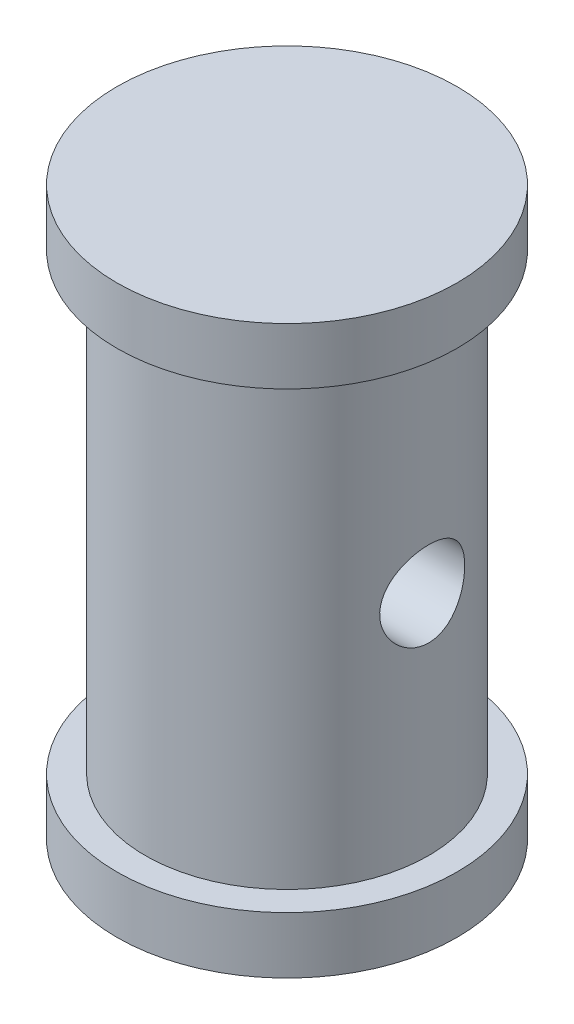
ISO-10303-21;
HEADER;
FILE_DESCRIPTION(('STEP AP214'),'2;1');
FILE_NAME('part.step','',(''),(''),'','','');
FILE_SCHEMA(('AUTOMOTIVE_DESIGN { 1 0 10303 214 1 1 1 1 }'));
ENDSEC;
DATA;
#1=APPLICATION_CONTEXT('core data for automotive mechanical design processes');
#2=APPLICATION_PROTOCOL_DEFINITION('international standard','automotive_design',2000,#1);
#3=PRODUCT_CONTEXT('',#1,'mechanical');
#4=PRODUCT('Part','Part','',(#3));
#5=PRODUCT_RELATED_PRODUCT_CATEGORY('part','',(#4));
#6=PRODUCT_DEFINITION_FORMATION('','',#4);
#7=PRODUCT_DEFINITION_CONTEXT('part definition',#1,'design');
#8=PRODUCT_DEFINITION('design','',#6,#7);
#9=PRODUCT_DEFINITION_SHAPE('','',#8);
#10=(LENGTH_UNIT() NAMED_UNIT(*) SI_UNIT(.MILLI.,.METRE.));
#11=(NAMED_UNIT(*) PLANE_ANGLE_UNIT() SI_UNIT($,.RADIAN.));
#12=(NAMED_UNIT(*) SI_UNIT($,.STERADIAN.) SOLID_ANGLE_UNIT());
#13=UNCERTAINTY_MEASURE_WITH_UNIT(LENGTH_MEASURE(1.E-05),#10,'distance_accuracy_value','');
#14=(GEOMETRIC_REPRESENTATION_CONTEXT(3) GLOBAL_UNCERTAINTY_ASSIGNED_CONTEXT((#13)) GLOBAL_UNIT_ASSIGNED_CONTEXT((#10,
#11,#12)) REPRESENTATION_CONTEXT('',''));
#15=CARTESIAN_POINT('',(0.,0.,0.));
#16=DIRECTION('',(0.,0.,1.));
#17=DIRECTION('',(1.,0.,0.));
#18=AXIS2_PLACEMENT_3D('',#15,#16,#17);
#19=CARTESIAN_POINT('',(0.,18.,0.));
#20=DIRECTION('',(0.,-1.,0.));
#21=DIRECTION('',(0.,0.,-1.));
#22=AXIS2_PLACEMENT_3D('',#19,#20,#21);
#23=CYLINDRICAL_SURFACE('',#22,2.49);
#24=CARTESIAN_POINT('',(0.,0.,0.));
#25=DIRECTION('',(0.,-1.,0.));
#26=DIRECTION('',(0.,0.,-1.));
#27=AXIS2_PLACEMENT_3D('',#24,#25,#26);
#28=CIRCLE('',#27,2.49);
#29=CARTESIAN_POINT('',(0.,0.,-2.49));
#30=VERTEX_POINT('',#29);
#31=EDGE_CURVE('E107',#30,#30,#28,.T.);
#32=ORIENTED_EDGE('',*,*,#31,.T.);
#33=EDGE_LOOP('',(#32));
#34=FACE_BOUND('',#33,.T.);
#35=CARTESIAN_POINT('',(0.,18.,0.));
#36=DIRECTION('',(0.,-1.,0.));
#37=DIRECTION('',(0.,0.,-1.));
#38=AXIS2_PLACEMENT_3D('',#35,#36,#37);
#39=CIRCLE('',#38,2.49);
#40=CARTESIAN_POINT('',(0.,18.,-2.49));
#41=VERTEX_POINT('',#40);
#42=EDGE_CURVE('E108',#41,#41,#39,.T.);
#43=ORIENTED_EDGE('',*,*,#42,.F.);
#44=EDGE_LOOP('',(#43));
#45=FACE_BOUND('',#44,.T.);
#46=DIRECTION('',(0.,-1.,0.));
#47=VECTOR('',#46,1.);
#48=CARTESIAN_POINT('',(2.,18.,1.4832734070292));
#49=LINE('',#48,#47);
#50=CARTESIAN_POINT('',(2.,9.77661692096311,1.4832734070292));
#51=VERTEX_POINT('',#50);
#52=CARTESIAN_POINT('',(2.,10.2233830790369,1.4832734070292));
#53=VERTEX_POINT('',#52);
#54=EDGE_CURVE('E11',#51,#53,#49,.F.);
#55=ORIENTED_EDGE('',*,*,#54,.F.);
#56=CARTESIAN_POINT('',(2.,9.77661692096311,1.4832734070292));
#57=CARTESIAN_POINT('',(2.00451641689461,9.73609208243435,1.47717343278689));
#58=CARTESIAN_POINT('',(2.01022262384104,9.69598702441084,1.46943176939736));
#59=CARTESIAN_POINT('',(2.02369617044362,9.61691701299149,1.45082492243512));
#60=CARTESIAN_POINT('',(2.03146074485795,9.57795060731097,1.43996392779848));
#61=CARTESIAN_POINT('',(2.05726523958766,9.46359673313475,1.40308679703302));
#62=CARTESIAN_POINT('',(2.07788962451289,9.39016774124797,1.37268464069959));
#63=CARTESIAN_POINT('',(2.12311483034521,9.25040653047264,1.30163053752464));
#64=CARTESIAN_POINT('',(2.14769608576624,9.18404193366019,1.26102849874818));
#65=CARTESIAN_POINT('',(2.19842868335353,9.05857350690383,1.17034961459316));
#66=CARTESIAN_POINT('',(2.22458355146461,8.99948696051237,1.1202509063738));
#67=CARTESIAN_POINT('',(2.27942183574636,8.88256516086136,1.00445908243937));
#68=CARTESIAN_POINT('',(2.30800628999421,8.82583484889207,0.937594761985534));
#69=CARTESIAN_POINT('',(2.36126710077192,8.72432556604292,0.793961191956514));
#70=CARTESIAN_POINT('',(2.38594581290057,8.67953938026696,0.717197963622885));
#71=CARTESIAN_POINT('',(2.42811984616116,8.60479699579717,0.557626576069205));
#72=CARTESIAN_POINT('',(2.44579522801062,8.57446433538724,0.475044790334752));
#73=CARTESIAN_POINT('',(2.47279943610715,8.52861083868138,0.304587571481967));
#74=CARTESIAN_POINT('',(2.48213884564127,8.51307121957895,0.216719002228572));
#75=CARTESIAN_POINT('',(2.49064075198707,8.49892951264923,0.0516329980521774));
#76=CARTESIAN_POINT('',(2.4910471870844,8.49825704699864,-0.0253492612048042));
#77=CARTESIAN_POINT('',(2.48479055568032,8.50865738092359,-0.178215862971857));
#78=CARTESIAN_POINT('',(2.47812855679429,8.51972840676358,-0.254100369531831));
#79=CARTESIAN_POINT('',(2.45890369026106,8.55215133926942,-0.398682832003539));
#80=CARTESIAN_POINT('',(2.44665900350464,8.5729502835423,-0.467549934062095));
#81=CARTESIAN_POINT('',(2.41741347557373,8.62369439093039,-0.600719189111875));
#82=CARTESIAN_POINT('',(2.40041225242278,8.65364028861477,-0.66502097496254));
#83=CARTESIAN_POINT('',(2.36127339937101,8.72467007467832,-0.793327726625811));
#84=CARTESIAN_POINT('',(2.33881833273497,8.7664942730993,-0.856824096984697));
#85=CARTESIAN_POINT('',(2.29151253258019,8.85872912233407,-0.976325134117998));
#86=CARTESIAN_POINT('',(2.26665856040578,8.90915145350719,-1.03231942222685));
#87=CARTESIAN_POINT('',(2.21299965172858,9.02518076091213,-1.14325520597899));
#88=CARTESIAN_POINT('',(2.18412378416384,9.0919233968638,-1.19697949229149));
#89=CARTESIAN_POINT('',(2.128921287042,9.23417164593233,-1.29260726860246));
#90=CARTESIAN_POINT('',(2.10258917235845,9.30965759553078,-1.33453658354129));
#91=CARTESIAN_POINT('',(2.06148014707517,9.44961181774251,-1.39694918681763));
#92=CARTESIAN_POINT('',(2.04544240223147,9.51248739677204,-1.42015766542006));
#93=CARTESIAN_POINT('',(2.01845652098597,9.64200979941398,-1.45823168519624));
#94=CARTESIAN_POINT('',(2.00752863319329,9.70867047212304,-1.47306408222207));
#95=CARTESIAN_POINT('',(2.,9.77661692096311,-1.4832734070292));
#96=B_SPLINE_CURVE_WITH_KNOTS('',3,(#56,#57,#58,#59,#60,#61,#62,#63,#64,#65,#66,#67,#68,#69,#70,
#71,#72,#73,#74,#75,#76,#77,#78,#79,#80,#81,#82,#83,#84,#85,#86,#87,#88,#89,#90,#91,#92,#93,#94,
#95),.UNSPECIFIED.,.F.,.F.,(4,2,2,2,2,2,2,2,2,2,2,2,2,2,2,2,2,2,2,4),(0.,0.123570687084218,
0.246976201392812,0.492018814911605,0.735885023862423,0.980319624023013,1.25569232237355,
1.53089830206557,1.79848029462242,2.06572208189424,2.29547143053522,2.52518608280284,
2.74318847416954,2.96120837737334,3.19812130367795,3.43535867259672,3.70541473963055,
3.974874836619,4.18086734203421,4.38766934849192),.UNSPECIFIED.);
#97=CARTESIAN_POINT('',(2.,9.77661692096311,-1.4832734070292));
#98=VERTEX_POINT('',#97);
#99=EDGE_CURVE('E47',#51,#98,#96,.T.);
#100=ORIENTED_EDGE('',*,*,#99,.T.);
#101=DIRECTION('',(0.,-1.,0.));
#102=VECTOR('',#101,1.);
#103=CARTESIAN_POINT('',(2.,18.,-1.4832734070292));
#104=LINE('',#103,#102);
#105=CARTESIAN_POINT('',(2.,10.2233830790369,-1.4832734070292));
#106=VERTEX_POINT('',#105);
#107=EDGE_CURVE('E57',#106,#98,#104,.T.);
#108=ORIENTED_EDGE('',*,*,#107,.F.);
#109=CARTESIAN_POINT('',(2.,10.2233830790369,-1.4832734070292));
#110=CARTESIAN_POINT('',(2.00451641689461,10.2639079175657,-1.47717343278689));
#111=CARTESIAN_POINT('',(2.01022262384104,10.3040129755892,-1.46943176939736));
#112=CARTESIAN_POINT('',(2.02369617044362,10.3830829870085,-1.45082492243512));
#113=CARTESIAN_POINT('',(2.03146074485795,10.422049392689,-1.43996392779848));
#114=CARTESIAN_POINT('',(2.05726523958766,10.5364032668653,-1.40308679703302));
#115=CARTESIAN_POINT('',(2.07788962451289,10.609832258752,-1.37268464069959));
#116=CARTESIAN_POINT('',(2.12311483034521,10.7495934695274,-1.30163053752464));
#117=CARTESIAN_POINT('',(2.14769608576624,10.8159580663398,-1.26102849874818));
#118=CARTESIAN_POINT('',(2.19842868335353,10.9414264930962,-1.17034961459316));
#119=CARTESIAN_POINT('',(2.22458355146461,11.0005130394876,-1.1202509063738));
#120=CARTESIAN_POINT('',(2.27942183574636,11.1174348391386,-1.00445908243937));
#121=CARTESIAN_POINT('',(2.30800628999421,11.1741651511079,-0.937594761985534));
#122=CARTESIAN_POINT('',(2.36126710077192,11.2756744339571,-0.793961191956514));
#123=CARTESIAN_POINT('',(2.38594581290057,11.320460619733,-0.717197963622885));
#124=CARTESIAN_POINT('',(2.42811984616116,11.3952030042028,-0.557626576069205));
#125=CARTESIAN_POINT('',(2.44579522801062,11.4255356646128,-0.475044790334752));
#126=CARTESIAN_POINT('',(2.47279943610715,11.4713891613186,-0.304587571481967));
#127=CARTESIAN_POINT('',(2.48213884564127,11.486928780421,-0.216719002228572));
#128=CARTESIAN_POINT('',(2.49064075198707,11.5010704873508,-0.0516329980521774));
#129=CARTESIAN_POINT('',(2.4910471870844,11.5017429530014,0.0253492612048042));
#130=CARTESIAN_POINT('',(2.48479055568032,11.4913426190764,0.178215862971857));
#131=CARTESIAN_POINT('',(2.47812855679429,11.4802715932364,0.254100369531831));
#132=CARTESIAN_POINT('',(2.45890369026106,11.4478486607306,0.398682832003538));
#133=CARTESIAN_POINT('',(2.44665900350464,11.4270497164577,0.467549934062095));
#134=CARTESIAN_POINT('',(2.41741347557373,11.3763056090696,0.600719189111875));
#135=CARTESIAN_POINT('',(2.40041225242278,11.3463597113852,0.66502097496254));
#136=CARTESIAN_POINT('',(2.36127339937101,11.2753299253217,0.793327726625811));
#137=CARTESIAN_POINT('',(2.33881833273497,11.2335057269007,0.856824096984696));
#138=CARTESIAN_POINT('',(2.29151253258019,11.1412708776659,0.976325134117997));
#139=CARTESIAN_POINT('',(2.26665856040578,11.0908485464928,1.03231942222685));
#140=CARTESIAN_POINT('',(2.21299965172858,10.9748192390879,1.14325520597899));
#141=CARTESIAN_POINT('',(2.18412378416384,10.9080766031362,1.19697949229149));
#142=CARTESIAN_POINT('',(2.128921287042,10.7658283540677,1.29260726860246));
#143=CARTESIAN_POINT('',(2.10258917235845,10.6903424044692,1.33453658354129));
#144=CARTESIAN_POINT('',(2.06148014707517,10.5503881822575,1.39694918681763));
#145=CARTESIAN_POINT('',(2.04544240223147,10.487512603228,1.42015766542006));
#146=CARTESIAN_POINT('',(2.01845652098597,10.357990200586,1.45823168519624));
#147=CARTESIAN_POINT('',(2.00752863319329,10.291329527877,1.47306408222207));
#148=CARTESIAN_POINT('',(2.,10.2233830790369,1.4832734070292));
#149=B_SPLINE_CURVE_WITH_KNOTS('',3,(#109,#110,#111,#112,#113,#114,#115,#116,#117,#118,#119,
#120,#121,#122,#123,#124,#125,#126,#127,#128,#129,#130,#131,#132,#133,#134,#135,#136,#137,#138,
#139,#140,#141,#142,#143,#144,#145,#146,#147,#148),.UNSPECIFIED.,.F.,.F.,(4,2,2,2,2,2,2,2,2,2,2,
2,2,2,2,2,2,2,2,4),(0.,0.123570687084218,0.246976201392812,0.492018814911605,0.735885023862423,
0.980319624023013,1.25569232237355,1.53089830206557,1.79848029462242,2.06572208189424,
2.29547143053522,2.52518608280284,2.74318847416954,2.96120837737334,3.19812130367795,
3.43535867259672,3.70541473963055,3.974874836619,4.18086734203421,4.38766934849192),.UNSPECIFIED.);
#150=EDGE_CURVE('E74',#106,#53,#149,.T.);
#151=ORIENTED_EDGE('',*,*,#150,.T.);
#152=EDGE_LOOP('',(#55,#100,#108,#151));
#153=FACE_BOUND('',#152,.T.);
#154=ADVANCED_FACE('F39',(#34,#45,#153),#23,.F.);
#155=CARTESIAN_POINT('',(0.,0.,0.));
#156=DIRECTION('',(0.,1.,0.));
#157=DIRECTION('',(0.,0.,1.));
#158=AXIS2_PLACEMENT_3D('',#155,#156,#157);
#159=PLANE('',#158);
#160=ORIENTED_EDGE('',*,*,#31,.F.);
#161=EDGE_LOOP('',(#160));
#162=FACE_BOUND('',#161,.T.);
#163=CARTESIAN_POINT('',(0.,0.,0.));
#164=DIRECTION('',(0.,-1.,0.));
#165=DIRECTION('',(0.,0.,-1.));
#166=AXIS2_PLACEMENT_3D('',#163,#164,#165);
#167=CIRCLE('',#166,6.);
#168=CARTESIAN_POINT('',(0.,0.,-6.));
#169=VERTEX_POINT('',#168);
#170=EDGE_CURVE('E78',#169,#169,#167,.T.);
#171=ORIENTED_EDGE('',*,*,#170,.T.);
#172=EDGE_LOOP('',(#171));
#173=FACE_BOUND('',#172,.T.);
#174=ADVANCED_FACE('F41',(#162,#173),#159,.F.);
#175=CARTESIAN_POINT('',(0.,0.,0.));
#176=DIRECTION('',(0.,-1.,0.));
#177=DIRECTION('',(0.,0.,-1.));
#178=AXIS2_PLACEMENT_3D('',#175,#176,#177);
#179=CYLINDRICAL_SURFACE('',#178,6.);
#180=ORIENTED_EDGE('',*,*,#170,.F.);
#181=EDGE_LOOP('',(#180));
#182=FACE_BOUND('',#181,.T.);
#183=CARTESIAN_POINT('',(0.,2.,0.));
#184=DIRECTION('',(0.,-1.,0.));
#185=DIRECTION('',(0.,0.,-1.));
#186=AXIS2_PLACEMENT_3D('',#183,#184,#185);
#187=CIRCLE('',#186,6.);
#188=CARTESIAN_POINT('',(0.,2.,-6.));
#189=VERTEX_POINT('',#188);
#190=EDGE_CURVE('E154',#189,#189,#187,.T.);
#191=ORIENTED_EDGE('',*,*,#190,.T.);
#192=EDGE_LOOP('',(#191));
#193=FACE_BOUND('',#192,.T.);
#194=ADVANCED_FACE('F120',(#182,#193),#179,.T.);
#195=CARTESIAN_POINT('',(-6.,2.,0.));
#196=DIRECTION('',(0.,-1.,0.));
#197=DIRECTION('',(0.,0.,-1.));
#198=AXIS2_PLACEMENT_3D('',#195,#196,#197);
#199=PLANE('',#198);
#200=ORIENTED_EDGE('',*,*,#190,.F.);
#201=EDGE_LOOP('',(#200));
#202=FACE_BOUND('',#201,.T.);
#203=CARTESIAN_POINT('',(0.,2.,0.));
#204=DIRECTION('',(0.,-1.,0.));
#205=DIRECTION('',(0.,0.,-1.));
#206=AXIS2_PLACEMENT_3D('',#203,#204,#205);
#207=CIRCLE('',#206,5.);
#208=CARTESIAN_POINT('',(0.,2.,-5.));
#209=VERTEX_POINT('',#208);
#210=EDGE_CURVE('E151',#209,#209,#207,.T.);
#211=ORIENTED_EDGE('',*,*,#210,.T.);
#212=EDGE_LOOP('',(#211));
#213=FACE_BOUND('',#212,.T.);
#214=ADVANCED_FACE('F116',(#202,#213),#199,.F.);
#215=CARTESIAN_POINT('',(0.,0.,0.));
#216=DIRECTION('',(0.,-1.,0.));
#217=DIRECTION('',(0.,0.,-1.));
#218=AXIS2_PLACEMENT_3D('',#215,#216,#217);
#219=CYLINDRICAL_SURFACE('',#218,5.);
#220=CARTESIAN_POINT('',(4.76969600708473,10.,-1.5));
#221=CARTESIAN_POINT('',(4.7696968572698,9.9178054520576,-1.49999897633764));
#222=CARTESIAN_POINT('',(4.77184390209069,9.83560077585598,-1.49322108167142));
#223=CARTESIAN_POINT('',(4.780165783029,9.67359475040806,-1.46635844446749));
#224=CARTESIAN_POINT('',(4.78634196493468,9.59379421349854,-1.44626925573578));
#225=CARTESIAN_POINT('',(4.80196102485632,9.43896527172827,-1.39352753269955));
#226=CARTESIAN_POINT('',(4.81139846703232,9.36392917036692,-1.36089589394243));
#227=CARTESIAN_POINT('',(4.83246932547567,9.2203780660047,-1.28406421917929));
#228=CARTESIAN_POINT('',(4.84410307041019,9.15186404131556,-1.23986245137053));
#229=CARTESIAN_POINT('',(4.86866862185765,9.02113360942263,-1.13964754141627));
#230=CARTESIAN_POINT('',(4.88162808311636,8.95915410205372,-1.08333207175807));
#231=CARTESIAN_POINT('',(4.90714861936757,8.84536204867749,-0.961136237579599));
#232=CARTESIAN_POINT('',(4.91970964297705,8.79355080955012,-0.895254645461112));
#233=CARTESIAN_POINT('',(4.94333214579389,8.7005373001667,-0.754111437793691));
#234=CARTESIAN_POINT('',(4.95435724342404,8.65957657555719,-0.678684021335815));
#235=CARTESIAN_POINT('',(4.97334435920684,8.59101274095725,-0.521624645369354));
#236=CARTESIAN_POINT('',(4.98130703789495,8.56340675014255,-0.439994028387912));
#237=CARTESIAN_POINT('',(4.99307646003589,8.5231199989095,-0.27532385263083));
#238=CARTESIAN_POINT('',(4.99699557369338,8.5100348723473,-0.192391398953802));
#239=CARTESIAN_POINT('',(5.00063201501348,8.49788267535356,-0.0254218237493157));
#240=CARTESIAN_POINT('',(5.00035022521079,8.49881266059804,0.0586150620503674));
#241=CARTESIAN_POINT('',(4.99569603817659,8.51439286854303,0.222571156600159));
#242=CARTESIAN_POINT('',(4.9914542020526,8.52860519380987,0.30253626764134));
#243=CARTESIAN_POINT('',(4.97951522112593,8.56963133599429,0.458889213442526));
#244=CARTESIAN_POINT('',(4.97181785750586,8.59644595094267,0.535276821322845));
#245=CARTESIAN_POINT('',(4.95365220986963,8.66221202341856,0.68334732635128));
#246=CARTESIAN_POINT('',(4.94315269676706,8.70130120280727,0.754965064694477));
#247=CARTESIAN_POINT('',(4.92049640648069,8.79039785242823,0.890764673783155));
#248=CARTESIAN_POINT('',(4.90833923637778,8.84040791296349,0.95494477487213));
#249=CARTESIAN_POINT('',(4.88311550488166,8.9521977507516,1.0766604815298));
#250=CARTESIAN_POINT('',(4.87003195321461,9.01435691902974,1.13384458040111));
#251=CARTESIAN_POINT('',(4.84483979887497,9.14751001789005,1.23707651539823));
#252=CARTESIAN_POINT('',(4.8327312931702,9.21850482538923,1.28312324482852));
#253=CARTESIAN_POINT('',(4.81077903197678,9.36823946924899,1.3631399533545));
#254=CARTESIAN_POINT('',(4.80095810695957,9.44704704586292,1.39698989237679));
#255=CARTESIAN_POINT('',(4.78496392548436,9.60960720844554,1.45083362878413));
#256=CARTESIAN_POINT('',(4.7787894791583,9.69335817153456,1.4708319464056));
#257=CARTESIAN_POINT('',(4.77104849541241,9.86008236073928,1.49574770282165));
#258=CARTESIAN_POINT('',(4.76931878670441,9.94296822389398,1.50119946380212));
#259=CARTESIAN_POINT('',(4.77021192441924,10.1084729000099,1.49835947233062));
#260=CARTESIAN_POINT('',(4.77283416156589,10.1910917487308,1.4900696437133));
#261=CARTESIAN_POINT('',(4.78197558554912,10.3514883779709,1.4604576357419));
#262=CARTESIAN_POINT('',(4.78839176507489,10.4293361642635,1.4394796143128));
#263=CARTESIAN_POINT('',(4.80429141231227,10.5804016908149,1.3854857774794));
#264=CARTESIAN_POINT('',(4.81377535359073,10.6536187141406,1.3524681034276));
#265=CARTESIAN_POINT('',(4.83505835023047,10.7955174640721,1.274318711965));
#266=CARTESIAN_POINT('',(4.84691271069798,10.8640247209858,1.22888564172729));
#267=CARTESIAN_POINT('',(4.87148205646987,10.9926381061808,1.12755301600385));
#268=CARTESIAN_POINT('',(4.88419724730003,11.0527422176128,1.07165095534897));
#269=CARTESIAN_POINT('',(4.90963633548158,11.1651804058147,0.948455132493599));
#270=CARTESIAN_POINT('',(4.92234245063004,11.217135628987,0.880811065857434));
#271=CARTESIAN_POINT('',(4.94584851748651,11.3089667010278,0.73746178459025));
#272=CARTESIAN_POINT('',(4.95664856384717,11.3488431497815,0.661756970543945));
#273=CARTESIAN_POINT('',(4.97505970474957,11.4150000305683,0.504935504705224));
#274=CARTESIAN_POINT('',(4.98269453424966,11.441382016159,0.423864622037841));
#275=CARTESIAN_POINT('',(4.99401979596827,11.4800609188904,0.25816996650459));
#276=CARTESIAN_POINT('',(4.9977113567088,11.4923618659484,0.173547217354765));
#277=CARTESIAN_POINT('',(5.00066544081399,11.5022230440545,0.00665215388274478));
#278=CARTESIAN_POINT('',(5.00009305111322,11.5003326954078,-0.0755851790862046));
#279=CARTESIAN_POINT('',(4.99497264465037,11.4831783675009,-0.238519481164402));
#280=CARTESIAN_POINT('',(4.99042485330462,11.4679151465196,-0.319216537346527));
#281=CARTESIAN_POINT('',(4.97791168358327,11.4247883386004,-0.475935813041356));
#282=CARTESIAN_POINT('',(4.96998352900866,11.397061819351,-0.55199892735139));
#283=CARTESIAN_POINT('',(4.9515294303945,11.3299180854928,-0.698433237752051));
#284=CARTESIAN_POINT('',(4.94100305949946,11.2904989497138,-0.768803496050578));
#285=CARTESIAN_POINT('',(4.91803965828228,11.19962654257,-0.904301892420561));
#286=CARTESIAN_POINT('',(4.90555226923559,11.1478285699992,-0.969190250076764));
#287=CARTESIAN_POINT('',(4.88023537212334,11.0342896116672,-1.08953757134594));
#288=CARTESIAN_POINT('',(4.86740576641079,10.9725457621019,-1.14499380960193));
#289=CARTESIAN_POINT('',(4.84240680631319,10.8386592216895,-1.24656269394549));
#290=CARTESIAN_POINT('',(4.83026852693485,10.7662614466096,-1.29234759757956));
#291=CARTESIAN_POINT('',(4.80852547508793,10.614444825839,-1.37104313528775));
#292=CARTESIAN_POINT('',(4.79891948596956,10.5350293763988,-1.40395995557288));
#293=CARTESIAN_POINT('',(4.78427816717594,10.3802595683937,-1.4530194253295));
#294=CARTESIAN_POINT('',(4.7788615484052,10.305391353069,-1.47058859011232));
#295=CARTESIAN_POINT('',(4.77157042597167,10.1536847775042,-1.49407818835144));
#296=CARTESIAN_POINT('',(4.7696952122143,10.0768468153548,-1.50000095706095));
#297=CARTESIAN_POINT('',(4.76969600708473,10.,-1.5));
#298=B_SPLINE_CURVE_WITH_KNOTS('',3,(#220,#221,#222,#223,#224,#225,#226,#227,#228,#229,#230,
#231,#232,#233,#234,#235,#236,#237,#238,#239,#240,#241,#242,#243,#244,#245,#246,#247,#248,#249,
#250,#251,#252,#253,#254,#255,#256,#257,#258,#259,#260,#261,#262,#263,#264,#265,#266,#267,#268,
#269,#270,#271,#272,#273,#274,#275,#276,#277,#278,#279,#280,#281,#282,#283,#284,#285,#286,#287,
#288,#289,#290,#291,#292,#293,#294,#295,#296,#297),.UNSPECIFIED.,.T.,.F.,(4,2,2,2,2,2,2,2,2,2,2,
2,2,2,2,2,2,2,2,2,2,2,2,2,2,2,2,2,2,2,2,2,2,2,2,2,2,2,4),(0.,0.246300165915544,
0.492682641688999,0.738656414466193,0.9846670253701,1.23773150007984,1.49082847871273,
1.74915939273644,2.00743455587877,2.25832140149558,2.5091555410144,2.7520012599088,
2.99486235890376,3.24055209335676,3.4863001659083,3.74152147023278,3.99676812491863,
4.25446238246266,4.51207250628411,4.76008080790309,5.00805439107387,5.24958594938817,
5.49115481045787,5.73920731809388,5.98731925928923,6.24479506100602,6.50225807324202,
6.75775391814325,7.01317662321682,7.2587630391122,7.50433553047754,7.74727096872219,
7.99024634491378,8.24099627054488,8.4918185262989,8.75011639669147,9.00828993963944,
9.23861153857448,9.4688869503356),.UNSPECIFIED.);
#299=CARTESIAN_POINT('',(4.76969600708473,10.,-1.5));
#300=VERTEX_POINT('',#299);
#301=EDGE_CURVE('E75',#300,#300,#298,.T.);
#302=ORIENTED_EDGE('',*,*,#301,.T.);
#303=EDGE_LOOP('',(#302));
#304=FACE_BOUND('',#303,.T.);
#305=ORIENTED_EDGE('',*,*,#210,.F.);
#306=EDGE_LOOP('',(#305));
#307=FACE_BOUND('',#306,.T.);
#308=CARTESIAN_POINT('',(0.,18.,0.));
#309=DIRECTION('',(0.,-1.,0.));
#310=DIRECTION('',(0.,0.,-1.));
#311=AXIS2_PLACEMENT_3D('',#308,#309,#310);
#312=CIRCLE('',#311,5.);
#313=CARTESIAN_POINT('',(0.,18.,-5.));
#314=VERTEX_POINT('',#313);
#315=EDGE_CURVE('E148',#314,#314,#312,.T.);
#316=ORIENTED_EDGE('',*,*,#315,.T.);
#317=EDGE_LOOP('',(#316));
#318=FACE_BOUND('',#317,.T.);
#319=ADVANCED_FACE('F110',(#304,#307,#318),#219,.T.);
#320=CARTESIAN_POINT('',(-5.,18.,0.));
#321=DIRECTION('',(0.,1.,0.));
#322=DIRECTION('',(0.,0.,1.));
#323=AXIS2_PLACEMENT_3D('',#320,#321,#322);
#324=PLANE('',#323);
#325=ORIENTED_EDGE('',*,*,#315,.F.);
#326=EDGE_LOOP('',(#325));
#327=FACE_BOUND('',#326,.T.);
#328=CARTESIAN_POINT('',(0.,18.,0.));
#329=DIRECTION('',(0.,-1.,0.));
#330=DIRECTION('',(0.,0.,-1.));
#331=AXIS2_PLACEMENT_3D('',#328,#329,#330);
#332=CIRCLE('',#331,6.);
#333=CARTESIAN_POINT('',(0.,18.,-6.));
#334=VERTEX_POINT('',#333);
#335=EDGE_CURVE('E143',#334,#334,#332,.T.);
#336=ORIENTED_EDGE('',*,*,#335,.T.);
#337=EDGE_LOOP('',(#336));
#338=FACE_BOUND('',#337,.T.);
#339=ADVANCED_FACE('F115',(#327,#338),#324,.F.);
#340=CARTESIAN_POINT('',(0.,0.,0.));
#341=DIRECTION('',(0.,-1.,0.));
#342=DIRECTION('',(0.,0.,-1.));
#343=AXIS2_PLACEMENT_3D('',#340,#341,#342);
#344=CYLINDRICAL_SURFACE('',#343,6.);
#345=ORIENTED_EDGE('',*,*,#335,.F.);
#346=EDGE_LOOP('',(#345));
#347=FACE_BOUND('',#346,.T.);
#348=CARTESIAN_POINT('',(0.,20.,0.));
#349=DIRECTION('',(0.,-1.,0.));
#350=DIRECTION('',(0.,0.,-1.));
#351=AXIS2_PLACEMENT_3D('',#348,#349,#350);
#352=CIRCLE('',#351,6.);
#353=CARTESIAN_POINT('',(0.,20.,-6.));
#354=VERTEX_POINT('',#353);
#355=EDGE_CURVE('E141',#354,#354,#352,.T.);
#356=ORIENTED_EDGE('',*,*,#355,.T.);
#357=EDGE_LOOP('',(#356));
#358=FACE_BOUND('',#357,.T.);
#359=ADVANCED_FACE('F167',(#347,#358),#344,.T.);
#360=CARTESIAN_POINT('',(-6.,20.,0.));
#361=DIRECTION('',(0.,-1.,0.));
#362=DIRECTION('',(0.,0.,-1.));
#363=AXIS2_PLACEMENT_3D('',#360,#361,#362);
#364=PLANE('',#363);
#365=ORIENTED_EDGE('',*,*,#355,.F.);
#366=EDGE_LOOP('',(#365));
#367=FACE_BOUND('',#366,.T.);
#368=ADVANCED_FACE('F172',(#367),#364,.F.);
#369=CARTESIAN_POINT('',(0.,18.,0.));
#370=DIRECTION('',(0.,-1.,0.));
#371=DIRECTION('',(0.,0.,-1.));
#372=AXIS2_PLACEMENT_3D('',#369,#370,#371);
#373=PLANE('',#372);
#374=ORIENTED_EDGE('',*,*,#42,.T.);
#375=EDGE_LOOP('',(#374));
#376=FACE_BOUND('',#375,.T.);
#377=ADVANCED_FACE('F97',(#376),#373,.T.);
#378=CARTESIAN_POINT('',(2.,10.,0.));
#379=DIRECTION('',(1.,0.,0.));
#380=DIRECTION('',(0.,0.,-1.));
#381=AXIS2_PLACEMENT_3D('',#378,#379,#380);
#382=CYLINDRICAL_SURFACE('',#381,1.5);
#383=CARTESIAN_POINT('',(2.,10.,0.));
#384=DIRECTION('',(1.,0.,0.));
#385=DIRECTION('',(0.,0.,-1.));
#386=AXIS2_PLACEMENT_3D('',#383,#384,#385);
#387=CIRCLE('',#386,1.5);
#388=EDGE_CURVE('E67',#53,#51,#387,.T.);
#389=ORIENTED_EDGE('',*,*,#388,.F.);
#390=ORIENTED_EDGE('',*,*,#150,.F.);
#391=EDGE_CURVE('E53',#98,#106,#387,.T.);
#392=ORIENTED_EDGE('',*,*,#391,.F.);
#393=ORIENTED_EDGE('',*,*,#99,.F.);
#394=EDGE_LOOP('',(#389,#390,#392,#393));
#395=FACE_BOUND('',#394,.T.);
#396=ORIENTED_EDGE('',*,*,#301,.F.);
#397=EDGE_LOOP('',(#396));
#398=FACE_BOUND('',#397,.T.);
#399=ADVANCED_FACE('F72',(#395,#398),#382,.F.);
#400=CARTESIAN_POINT('',(2.,10.,0.));
#401=DIRECTION('',(1.,0.,0.));
#402=DIRECTION('',(0.,0.,-1.));
#403=AXIS2_PLACEMENT_3D('',#400,#401,#402);
#404=PLANE('',#403);
#405=ORIENTED_EDGE('',*,*,#54,.T.);
#406=ORIENTED_EDGE('',*,*,#388,.T.);
#407=EDGE_LOOP('',(#405,#406));
#408=FACE_BOUND('',#407,.T.);
#409=ADVANCED_FACE('F66',(#408),#404,.T.);
#410=ORIENTED_EDGE('',*,*,#107,.T.);
#411=ORIENTED_EDGE('',*,*,#391,.T.);
#412=EDGE_LOOP('',(#410,#411));
#413=FACE_BOUND('',#412,.T.);
#414=ADVANCED_FACE('F236',(#413),#404,.T.);
#415=CLOSED_SHELL('',(#154,#174,#194,#214,#319,#339,#359,#368,#377,#399,#409,#414));
#416=MANIFOLD_SOLID_BREP('B2',#415);
#417=ADVANCED_BREP_SHAPE_REPRESENTATION('',(#18,#416),#14);
#418=SHAPE_DEFINITION_REPRESENTATION(#9,#417);
ENDSEC;
END-ISO-10303-21;
